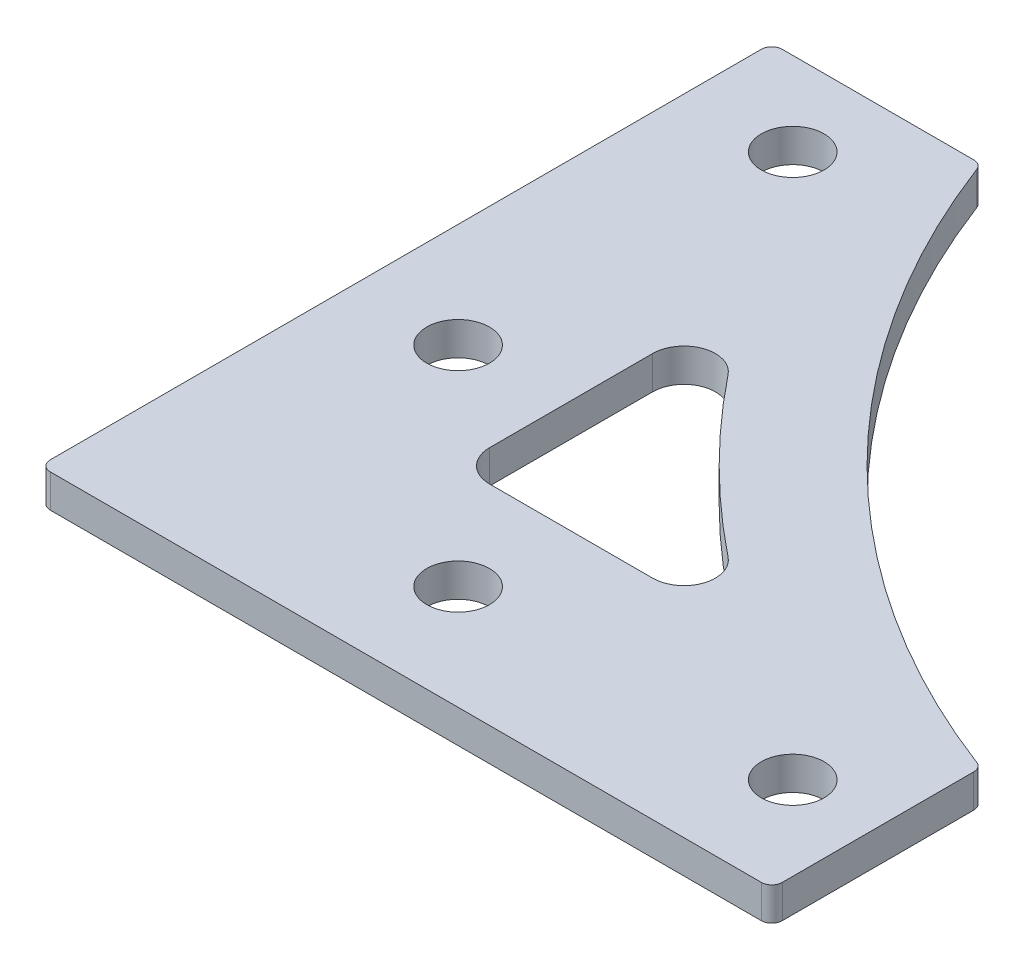
ISO-10303-21;
HEADER;
FILE_DESCRIPTION(('STEP AP214'),'2;1');
FILE_NAME('part.step','',(''),(''),'','','');
FILE_SCHEMA(('AUTOMOTIVE_DESIGN { 1 0 10303 214 1 1 1 1 }'));
ENDSEC;
DATA;
#1=APPLICATION_CONTEXT('core data for automotive mechanical design processes');
#2=APPLICATION_PROTOCOL_DEFINITION('international standard','automotive_design',2000,#1);
#3=PRODUCT_CONTEXT('',#1,'mechanical');
#4=PRODUCT('Part','Part','',(#3));
#5=PRODUCT_RELATED_PRODUCT_CATEGORY('part','',(#4));
#6=PRODUCT_DEFINITION_FORMATION('','',#4);
#7=PRODUCT_DEFINITION_CONTEXT('part definition',#1,'design');
#8=PRODUCT_DEFINITION('design','',#6,#7);
#9=PRODUCT_DEFINITION_SHAPE('','',#8);
#10=(LENGTH_UNIT() NAMED_UNIT(*) SI_UNIT(.MILLI.,.METRE.));
#11=(NAMED_UNIT(*) PLANE_ANGLE_UNIT() SI_UNIT($,.RADIAN.));
#12=(NAMED_UNIT(*) SI_UNIT($,.STERADIAN.) SOLID_ANGLE_UNIT());
#13=UNCERTAINTY_MEASURE_WITH_UNIT(LENGTH_MEASURE(1.E-05),#10,'distance_accuracy_value','');
#14=(GEOMETRIC_REPRESENTATION_CONTEXT(3) GLOBAL_UNCERTAINTY_ASSIGNED_CONTEXT((#13)) GLOBAL_UNIT_ASSIGNED_CONTEXT((#10,
#11,#12)) REPRESENTATION_CONTEXT('',''));
#15=CARTESIAN_POINT('',(0.,0.,0.));
#16=DIRECTION('',(0.,0.,1.));
#17=DIRECTION('',(1.,0.,0.));
#18=AXIS2_PLACEMENT_3D('',#15,#16,#17);
#19=CARTESIAN_POINT('',(10.,0.,40.));
#20=DIRECTION('',(0.,1.,0.));
#21=DIRECTION('',(0.,0.,1.));
#22=AXIS2_PLACEMENT_3D('',#19,#20,#21);
#23=CYLINDRICAL_SURFACE('',#22,3.);
#24=CARTESIAN_POINT('',(10.00000000001,1.00133226762955E-11,40.00000000001));
#25=DIRECTION('',(0.,-1.,3.3336664002296E-12));
#26=DIRECTION('',(0.,3.3336664002296E-12,1.));
#27=AXIS2_PLACEMENT_3D('',#24,#25,#26);
#28=CIRCLE('',#27,3.00000000001);
#29=CARTESIAN_POINT('',(10.00000000001,2.00143218770177E-11,43.00000000002));
#30=VERTEX_POINT('',#29);
#31=EDGE_CURVE('E159',#30,#30,#28,.T.);
#32=ORIENTED_EDGE('',*,*,#31,.F.);
#33=EDGE_LOOP('',(#32));
#34=FACE_BOUND('',#33,.T.);
#35=CARTESIAN_POINT('',(10.00000000001,-3.17500000000999,40.00000000001));
#36=DIRECTION('',(0.,1.,-3.33362245390155E-12));
#37=DIRECTION('',(0.,3.33362245390155E-12,1.));
#38=AXIS2_PLACEMENT_3D('',#35,#36,#37);
#39=CIRCLE('',#38,3.00000000001);
#40=CARTESIAN_POINT('',(10.00000000001,-3.17499999999999,43.00000000002));
#41=VERTEX_POINT('',#40);
#42=EDGE_CURVE('E231',#41,#41,#39,.T.);
#43=ORIENTED_EDGE('',*,*,#42,.F.);
#44=EDGE_LOOP('',(#43));
#45=FACE_BOUND('',#44,.T.);
#46=ADVANCED_FACE('F17',(#34,#45),#23,.F.);
#47=CARTESIAN_POINT('',(10.,0.,8.));
#48=DIRECTION('',(0.,1.,0.));
#49=DIRECTION('',(0.,0.,1.));
#50=AXIS2_PLACEMENT_3D('',#47,#48,#49);
#51=CYLINDRICAL_SURFACE('',#50,3.);
#52=CARTESIAN_POINT('',(10.00000000001,1.00026645352591E-11,8.00000000001));
#53=DIRECTION('',(0.,-1.,3.33366640022961E-12));
#54=DIRECTION('',(0.,3.33366640022961E-12,1.));
#55=AXIS2_PLACEMENT_3D('',#52,#53,#54);
#56=CIRCLE('',#55,3.00000000001);
#57=CARTESIAN_POINT('',(10.00000000001,2.00036637359813E-11,11.00000000002));
#58=VERTEX_POINT('',#57);
#59=EDGE_CURVE('E184',#58,#58,#56,.T.);
#60=ORIENTED_EDGE('',*,*,#59,.F.);
#61=EDGE_LOOP('',(#60));
#62=FACE_BOUND('',#61,.T.);
#63=CARTESIAN_POINT('',(10.00000000001,-3.17500000001,8.00000000001));
#64=DIRECTION('',(0.,1.,-3.33362245390155E-12));
#65=DIRECTION('',(0.,3.33362245390155E-12,1.));
#66=AXIS2_PLACEMENT_3D('',#63,#64,#65);
#67=CIRCLE('',#66,3.00000000001);
#68=CARTESIAN_POINT('',(10.00000000001,-3.175,11.00000000002));
#69=VERTEX_POINT('',#68);
#70=EDGE_CURVE('E238',#69,#69,#67,.T.);
#71=ORIENTED_EDGE('',*,*,#70,.F.);
#72=EDGE_LOOP('',(#71));
#73=FACE_BOUND('',#72,.T.);
#74=ADVANCED_FACE('F918',(#62,#73),#51,.F.);
#75=CARTESIAN_POINT('',(30.,0.,60.));
#76=DIRECTION('',(0.,1.,0.));
#77=DIRECTION('',(0.,0.,1.));
#78=AXIS2_PLACEMENT_3D('',#75,#76,#77);
#79=CYLINDRICAL_SURFACE('',#78,3.);
#80=CARTESIAN_POINT('',(30.00000000001,1.00199840144432E-11,60.00000000001));
#81=DIRECTION('',(0.,-1.,3.3336664002296E-12));
#82=DIRECTION('',(0.,3.3336664002296E-12,1.));
#83=AXIS2_PLACEMENT_3D('',#80,#81,#82);
#84=CIRCLE('',#83,3.00000000001);
#85=CARTESIAN_POINT('',(30.00000000001,2.00209832151654E-11,63.00000000002));
#86=VERTEX_POINT('',#85);
#87=EDGE_CURVE('E219',#86,#86,#84,.T.);
#88=ORIENTED_EDGE('',*,*,#87,.F.);
#89=EDGE_LOOP('',(#88));
#90=FACE_BOUND('',#89,.T.);
#91=CARTESIAN_POINT('',(30.00000000001,-3.17500000000998,60.00000000001));
#92=DIRECTION('',(0.,1.,-3.33362245390155E-12));
#93=DIRECTION('',(0.,3.33362245390155E-12,1.));
#94=AXIS2_PLACEMENT_3D('',#91,#92,#93);
#95=CIRCLE('',#94,3.00000000001);
#96=CARTESIAN_POINT('',(30.00000000001,-3.17499999999998,63.00000000002));
#97=VERTEX_POINT('',#96);
#98=EDGE_CURVE('E267',#97,#97,#95,.T.);
#99=ORIENTED_EDGE('',*,*,#98,.F.);
#100=EDGE_LOOP('',(#99));
#101=FACE_BOUND('',#100,.T.);
#102=ADVANCED_FACE('F1105',(#90,#101),#79,.F.);
#103=CARTESIAN_POINT('',(62.,0.,60.));
#104=DIRECTION('',(0.,1.,0.));
#105=DIRECTION('',(0.,0.,1.));
#106=AXIS2_PLACEMENT_3D('',#103,#104,#105);
#107=CYLINDRICAL_SURFACE('',#106,3.);
#108=CARTESIAN_POINT('',(62.00000000001,1.00199840144432E-11,60.00000000001));
#109=DIRECTION('',(0.,-1.,3.3336664002296E-12));
#110=DIRECTION('',(0.,3.3336664002296E-12,1.));
#111=AXIS2_PLACEMENT_3D('',#108,#109,#110);
#112=CIRCLE('',#111,3.00000000001);
#113=CARTESIAN_POINT('',(62.00000000001,2.00209832151654E-11,63.00000000002));
#114=VERTEX_POINT('',#113);
#115=EDGE_CURVE('E215',#114,#114,#112,.T.);
#116=ORIENTED_EDGE('',*,*,#115,.F.);
#117=EDGE_LOOP('',(#116));
#118=FACE_BOUND('',#117,.T.);
#119=CARTESIAN_POINT('',(62.00000000001,-3.17500000000998,60.00000000001));
#120=DIRECTION('',(0.,1.,-3.33362245390155E-12));
#121=DIRECTION('',(0.,3.33362245390155E-12,1.));
#122=AXIS2_PLACEMENT_3D('',#119,#120,#121);
#123=CIRCLE('',#122,3.00000000001);
#124=CARTESIAN_POINT('',(62.00000000001,-3.17499999999998,63.00000000002));
#125=VERTEX_POINT('',#124);
#126=EDGE_CURVE('E262',#125,#125,#123,.T.);
#127=ORIENTED_EDGE('',*,*,#126,.F.);
#128=EDGE_LOOP('',(#127));
#129=FACE_BOUND('',#128,.T.);
#130=ADVANCED_FACE('F1142',(#118,#129),#107,.F.);
#131=CARTESIAN_POINT('',(23.,0.,31.395610759357));
#132=DIRECTION('',(0.,-1.,0.));
#133=DIRECTION('',(0.,0.,-1.));
#134=AXIS2_PLACEMENT_3D('',#131,#132,#133);
#135=CYLINDRICAL_SURFACE('',#134,3.);
#136=CARTESIAN_POINT('',(23.00000000001,1.00104568389812E-11,31.395610759367));
#137=DIRECTION('',(0.,-1.,3.33366640022961E-12));
#138=DIRECTION('',(0.,-3.33366640022961E-12,-1.));
#139=AXIS2_PLACEMENT_3D('',#136,#137,#138);
#140=CIRCLE('',#139,3.00000000001);
#141=CARTESIAN_POINT('',(20.,0.,31.395610759357));
#142=VERTEX_POINT('',#141);
#143=CARTESIAN_POINT('',(25.3466743195682,0.,29.5266218247059));
#144=VERTEX_POINT('',#143);
#145=EDGE_CURVE('E281',#142,#144,#140,.T.);
#146=ORIENTED_EDGE('',*,*,#145,.F.);
#147=DIRECTION('',(0.,1.,0.));
#148=VECTOR('',#147,1.);
#149=CARTESIAN_POINT('',(20.00000000001,1.00104568389812E-11,31.395610759367));
#150=LINE('',#149,#148);
#151=CARTESIAN_POINT('',(20.,-3.175,31.395610759357));
#152=VERTEX_POINT('',#151);
#153=EDGE_CURVE('E246',#152,#142,#150,.T.);
#154=ORIENTED_EDGE('',*,*,#153,.F.);
#155=CARTESIAN_POINT('',(23.00000000001,-3.17500000000999,31.395610759367));
#156=DIRECTION('',(-3.33333333331111E-12,1.,-3.33362245391267E-12));
#157=DIRECTION('',(3.33564629795685E-12,-3.33362245390155E-12,-1.));
#158=AXIS2_PLACEMENT_3D('',#155,#156,#157);
#159=CIRCLE('',#158,3.00000000001);
#160=CARTESIAN_POINT('',(25.3466743195703,-3.175,29.5266218247043));
#161=VERTEX_POINT('',#160);
#162=EDGE_CURVE('E43',#161,#152,#159,.T.);
#163=ORIENTED_EDGE('',*,*,#162,.F.);
#164=DIRECTION('',(0.,-1.,0.));
#165=VECTOR('',#164,1.);
#166=CARTESIAN_POINT('',(25.3466743195782,1.00098343406167E-11,29.526621824716));
#167=LINE('',#166,#165);
#168=EDGE_CURVE('E307',#144,#161,#167,.T.);
#169=ORIENTED_EDGE('',*,*,#168,.F.);
#170=EDGE_LOOP('',(#146,#154,#163,#169));
#171=FACE_BOUND('',#170,.T.);
#172=ADVANCED_FACE('F1076',(#171),#135,.F.);
#173=CARTESIAN_POINT('',(70.,0.,50.));
#174=DIRECTION('',(0.,1.,0.));
#175=DIRECTION('',(1.,0.,0.));
#176=AXIS2_PLACEMENT_3D('',#173,#174,#175);
#177=PLANE('',#176);
#178=DIRECTION('',(1.,0.,0.));
#179=VECTOR('',#178,1.);
#180=CARTESIAN_POINT('',(70.00000000001,1.00233146835171E-11,70.00000000001));
#181=LINE('',#180,#179);
#182=CARTESIAN_POINT('',(1.,0.,70.));
#183=VERTEX_POINT('',#182);
#184=CARTESIAN_POINT('',(69.,0.,70.));
#185=VERTEX_POINT('',#184);
#186=EDGE_CURVE('E11',#183,#185,#181,.T.);
#187=ORIENTED_EDGE('',*,*,#186,.T.);
#188=CARTESIAN_POINT('',(69.00000000001,1.00229816166097E-11,69.00000000001));
#189=DIRECTION('',(0.,-1.,1.00003330668074E-11));
#190=DIRECTION('',(0.,-1.00003330668074E-11,-1.));
#191=AXIS2_PLACEMENT_3D('',#188,#189,#190);
#192=CIRCLE('',#191,1.00000000001);
#193=CARTESIAN_POINT('',(70.,0.,69.));
#194=VERTEX_POINT('',#193);
#195=EDGE_CURVE('E205',#194,#185,#192,.T.);
#196=ORIENTED_EDGE('',*,*,#195,.F.);
#197=DIRECTION('',(0.,0.,-1.));
#198=VECTOR('',#197,1.);
#199=CARTESIAN_POINT('',(70.00000000001,1.00166533453694E-11,50.00000000001));
#200=LINE('',#199,#198);
#201=CARTESIAN_POINT('',(70.,0.,50.691740945641));
#202=VERTEX_POINT('',#201);
#203=EDGE_CURVE('E28',#194,#202,#200,.T.);
#204=ORIENTED_EDGE('',*,*,#203,.T.);
#205=CARTESIAN_POINT('',(69.00000000001,1.00168837413868E-11,50.691740945651));
#206=DIRECTION('',(0.,-1.,1.00003330668074E-11));
#207=DIRECTION('',(0.,-1.00003330668074E-11,-1.));
#208=AXIS2_PLACEMENT_3D('',#205,#206,#207);
#209=CIRCLE('',#208,1.00000000001);
#210=CARTESIAN_POINT('',(69.3564886950297,0.,49.757441309385));
#211=VERTEX_POINT('',#210);
#212=EDGE_CURVE('E81',#211,#202,#209,.T.);
#213=ORIENTED_EDGE('',*,*,#212,.F.);
#214=CARTESIAN_POINT('',(99.658027772699,-1.00098781075895E-11,-29.65802777269));
#215=DIRECTION('',(0.,-1.,1.17980125730903E-13));
#216=DIRECTION('',(0.,1.17980125730903E-13,1.));
#217=AXIS2_PLACEMENT_3D('',#214,#215,#216);
#218=CIRCLE('',#217,85.00000000001);
#219=CARTESIAN_POINT('',(20.2425586906175,0.,0.643511304969427));
#220=VERTEX_POINT('',#219);
#221=EDGE_CURVE('E187',#211,#220,#218,.T.);
#222=ORIENTED_EDGE('',*,*,#221,.T.);
#223=CARTESIAN_POINT('',(19.308259054369,1.00003330669074E-11,1.00000000001));
#224=DIRECTION('',(0.,-1.,1.00003330668074E-11));
#225=DIRECTION('',(0.,-1.00003330668074E-11,-1.));
#226=AXIS2_PLACEMENT_3D('',#223,#224,#225);
#227=CIRCLE('',#226,1.00000000001);
#228=CARTESIAN_POINT('',(19.308259054359,0.,0.));
#229=VERTEX_POINT('',#228);
#230=EDGE_CURVE('E96',#229,#220,#227,.T.);
#231=ORIENTED_EDGE('',*,*,#230,.F.);
#232=DIRECTION('',(-1.,0.,0.));
#233=VECTOR('',#232,1.);
#234=CARTESIAN_POINT('',(70.00000000001,1.E-11,-1.E-11));
#235=LINE('',#234,#233);
#236=CARTESIAN_POINT('',(1.,0.,0.));
#237=VERTEX_POINT('',#236);
#238=EDGE_CURVE('E145',#229,#237,#235,.T.);
#239=ORIENTED_EDGE('',*,*,#238,.T.);
#240=CARTESIAN_POINT('',(1.00000000001,1.00003330669074E-11,1.00000000001));
#241=DIRECTION('',(0.,-1.,1.00003330668074E-11));
#242=DIRECTION('',(0.,-1.00003330668074E-11,-1.));
#243=AXIS2_PLACEMENT_3D('',#240,#241,#242);
#244=CIRCLE('',#243,1.00000000001);
#245=CARTESIAN_POINT('',(0.,0.,1.));
#246=VERTEX_POINT('',#245);
#247=EDGE_CURVE('E137',#246,#237,#244,.T.);
#248=ORIENTED_EDGE('',*,*,#247,.F.);
#249=DIRECTION('',(0.,0.,1.));
#250=VECTOR('',#249,1.);
#251=CARTESIAN_POINT('',(0.,1.00166533453694E-11,50.00000000001));
#252=LINE('',#251,#250);
#253=CARTESIAN_POINT('',(0.,0.,69.));
#254=VERTEX_POINT('',#253);
#255=EDGE_CURVE('E142',#246,#254,#252,.T.);
#256=ORIENTED_EDGE('',*,*,#255,.T.);
#257=CARTESIAN_POINT('',(1.00000000001,1.00229816166097E-11,69.00000000001));
#258=DIRECTION('',(0.,-1.,1.00003330668074E-11));
#259=DIRECTION('',(0.,-1.00003330668074E-11,-1.));
#260=AXIS2_PLACEMENT_3D('',#257,#258,#259);
#261=CIRCLE('',#260,1.00000000001);
#262=EDGE_CURVE('E193',#183,#254,#261,.T.);
#263=ORIENTED_EDGE('',*,*,#262,.F.);
#264=EDGE_LOOP('',(#187,#196,#204,#213,#222,#231,#239,#248,#256,#263));
#265=FACE_BOUND('',#264,.T.);
#266=ORIENTED_EDGE('',*,*,#31,.T.);
#267=EDGE_LOOP('',(#266));
#268=FACE_BOUND('',#267,.T.);
#269=ORIENTED_EDGE('',*,*,#59,.T.);
#270=EDGE_LOOP('',(#269));
#271=FACE_BOUND('',#270,.T.);
#272=ORIENTED_EDGE('',*,*,#87,.T.);
#273=EDGE_LOOP('',(#272));
#274=FACE_BOUND('',#273,.T.);
#275=ORIENTED_EDGE('',*,*,#115,.T.);
#276=EDGE_LOOP('',(#275));
#277=FACE_BOUND('',#276,.T.);
#278=CARTESIAN_POINT('',(99.658027772699,-1.00098781075895E-11,-29.65802777269));
#279=DIRECTION('',(0.,1.,-1.05596224802113E-13));
#280=DIRECTION('',(0.,1.05596224802113E-13,1.));
#281=AXIS2_PLACEMENT_3D('',#278,#279,#280);
#282=CIRCLE('',#281,95.00000000001);
#283=CARTESIAN_POINT('',(40.4733781752974,0.,44.6533256804279));
#284=VERTEX_POINT('',#283);
#285=EDGE_CURVE('E220',#144,#284,#282,.T.);
#286=ORIENTED_EDGE('',*,*,#285,.T.);
#287=CARTESIAN_POINT('',(38.604389240653,1.00156541446472E-11,47.00000000001));
#288=DIRECTION('',(0.,-1.,3.3336664002296E-12));
#289=DIRECTION('',(0.,-3.3336664002296E-12,-1.));
#290=AXIS2_PLACEMENT_3D('',#287,#288,#289);
#291=CIRCLE('',#290,3.00000000001);
#292=CARTESIAN_POINT('',(38.604389240643,0.,50.));
#293=VERTEX_POINT('',#292);
#294=EDGE_CURVE('E198',#284,#293,#291,.T.);
#295=ORIENTED_EDGE('',*,*,#294,.T.);
#296=DIRECTION('',(-1.,0.,0.));
#297=VECTOR('',#296,1.);
#298=CARTESIAN_POINT('',(70.00000000001,1.00166533453694E-11,50.00000000001));
#299=LINE('',#298,#297);
#300=CARTESIAN_POINT('',(23.,0.,50.));
#301=VERTEX_POINT('',#300);
#302=EDGE_CURVE('E194',#293,#301,#299,.T.);
#303=ORIENTED_EDGE('',*,*,#302,.T.);
#304=CARTESIAN_POINT('',(23.00000000001,1.00156541446472E-11,47.00000000001));
#305=DIRECTION('',(0.,-1.,3.3336664002296E-12));
#306=DIRECTION('',(0.,-3.3336664002296E-12,-1.));
#307=AXIS2_PLACEMENT_3D('',#304,#305,#306);
#308=CIRCLE('',#307,3.00000000001);
#309=CARTESIAN_POINT('',(20.,0.,47.));
#310=VERTEX_POINT('',#309);
#311=EDGE_CURVE('E199',#301,#310,#308,.T.);
#312=ORIENTED_EDGE('',*,*,#311,.T.);
#313=DIRECTION('',(0.,0.,-1.));
#314=VECTOR('',#313,1.);
#315=CARTESIAN_POINT('',(20.00000000001,1.00166533453694E-11,50.00000000001));
#316=LINE('',#315,#314);
#317=EDGE_CURVE('E280',#310,#142,#316,.T.);
#318=ORIENTED_EDGE('',*,*,#317,.T.);
#319=ORIENTED_EDGE('',*,*,#145,.T.);
#320=EDGE_LOOP('',(#286,#295,#303,#312,#318,#319));
#321=FACE_BOUND('',#320,.T.);
#322=ADVANCED_FACE('F139',(#265,#268,#271,#274,#277,#321),#177,.T.);
#323=CARTESIAN_POINT('',(38.604389240643,0.,47.));
#324=DIRECTION('',(0.,-1.,0.));
#325=DIRECTION('',(0.,0.,-1.));
#326=AXIS2_PLACEMENT_3D('',#323,#324,#325);
#327=CYLINDRICAL_SURFACE('',#326,3.);
#328=DIRECTION('',(0.,1.,0.));
#329=VECTOR('',#328,1.);
#330=CARTESIAN_POINT('',(40.4733781753072,1.00148725450889E-11,44.6533256804377));
#331=LINE('',#330,#329);
#332=CARTESIAN_POINT('',(40.4733781752974,-3.175,44.6533256804279));
#333=VERTEX_POINT('',#332);
#334=EDGE_CURVE('E285',#333,#284,#331,.T.);
#335=ORIENTED_EDGE('',*,*,#334,.F.);
#336=CARTESIAN_POINT('',(38.604389240653,-3.17500000000999,47.00000000001));
#337=DIRECTION('',(0.,1.,-3.33362245390155E-12));
#338=DIRECTION('',(0.,-3.33362245390155E-12,-1.));
#339=AXIS2_PLACEMENT_3D('',#336,#337,#338);
#340=CIRCLE('',#339,3.00000000001);
#341=CARTESIAN_POINT('',(38.604389240643,-3.175,50.));
#342=VERTEX_POINT('',#341);
#343=EDGE_CURVE('E176',#342,#333,#340,.T.);
#344=ORIENTED_EDGE('',*,*,#343,.F.);
#345=DIRECTION('',(0.,-1.,0.));
#346=VECTOR('',#345,1.);
#347=CARTESIAN_POINT('',(38.604389240653,1.00166533453694E-11,50.00000000001));
#348=LINE('',#347,#346);
#349=EDGE_CURVE('E275',#293,#342,#348,.T.);
#350=ORIENTED_EDGE('',*,*,#349,.F.);
#351=ORIENTED_EDGE('',*,*,#294,.F.);
#352=EDGE_LOOP('',(#335,#344,#350,#351));
#353=FACE_BOUND('',#352,.T.);
#354=ADVANCED_FACE('F344',(#353),#327,.F.);
#355=CARTESIAN_POINT('',(99.658027772689,0.,-29.65802777268));
#356=DIRECTION('',(0.,1.,0.));
#357=DIRECTION('',(0.,0.,1.));
#358=AXIS2_PLACEMENT_3D('',#355,#356,#357);
#359=CYLINDRICAL_SURFACE('',#358,95.);
#360=ORIENTED_EDGE('',*,*,#334,.T.);
#361=ORIENTED_EDGE('',*,*,#285,.F.);
#362=ORIENTED_EDGE('',*,*,#168,.T.);
#363=CARTESIAN_POINT('',(99.658027772699,-3.17500000001001,-29.65802777269));
#364=DIRECTION('',(0.,1.,-1.05596407404584E-13));
#365=DIRECTION('',(0.,1.05596407404584E-13,1.));
#366=AXIS2_PLACEMENT_3D('',#363,#364,#365);
#367=CIRCLE('',#366,95.00000000001);
#368=EDGE_CURVE('E313',#161,#333,#367,.T.);
#369=ORIENTED_EDGE('',*,*,#368,.T.);
#370=EDGE_LOOP('',(#360,#361,#362,#369));
#371=FACE_BOUND('',#370,.T.);
#372=ADVANCED_FACE('F1065',(#371),#359,.T.);
#373=CARTESIAN_POINT('',(20.,0.,50.));
#374=DIRECTION('',(1.,0.,0.));
#375=DIRECTION('',(0.,1.,0.));
#376=AXIS2_PLACEMENT_3D('',#373,#374,#375);
#377=PLANE('',#376);
#378=DIRECTION('',(0.,0.,-1.));
#379=VECTOR('',#378,1.);
#380=CARTESIAN_POINT('',(20.00000000001,-3.17500000000999,50.00000000001));
#381=LINE('',#380,#379);
#382=CARTESIAN_POINT('',(20.,-3.175,47.));
#383=VERTEX_POINT('',#382);
#384=EDGE_CURVE('E309',#383,#152,#381,.T.);
#385=ORIENTED_EDGE('',*,*,#384,.T.);
#386=ORIENTED_EDGE('',*,*,#153,.T.);
#387=ORIENTED_EDGE('',*,*,#317,.F.);
#388=DIRECTION('',(0.,-1.,0.));
#389=VECTOR('',#388,1.);
#390=CARTESIAN_POINT('',(20.00000000001,1.00159872115546E-11,47.00000000001));
#391=LINE('',#390,#389);
#392=EDGE_CURVE('E242',#310,#383,#391,.T.);
#393=ORIENTED_EDGE('',*,*,#392,.T.);
#394=EDGE_LOOP('',(#385,#386,#387,#393));
#395=FACE_BOUND('',#394,.T.);
#396=ADVANCED_FACE('F1048',(#395),#377,.T.);
#397=CARTESIAN_POINT('',(23.,0.,47.));
#398=DIRECTION('',(0.,-1.,0.));
#399=DIRECTION('',(0.,0.,-1.));
#400=AXIS2_PLACEMENT_3D('',#397,#398,#399);
#401=CYLINDRICAL_SURFACE('',#400,3.);
#402=CARTESIAN_POINT('',(23.00000000001,-3.17500000000999,47.00000000001));
#403=DIRECTION('',(0.,1.,-3.33362245390155E-12));
#404=DIRECTION('',(0.,-3.33362245390155E-12,-1.));
#405=AXIS2_PLACEMENT_3D('',#402,#403,#404);
#406=CIRCLE('',#405,3.00000000001);
#407=CARTESIAN_POINT('',(23.,-3.175,50.));
#408=VERTEX_POINT('',#407);
#409=EDGE_CURVE('E263',#383,#408,#406,.T.);
#410=ORIENTED_EDGE('',*,*,#409,.F.);
#411=ORIENTED_EDGE('',*,*,#392,.F.);
#412=ORIENTED_EDGE('',*,*,#311,.F.);
#413=DIRECTION('',(0.,1.,0.));
#414=VECTOR('',#413,1.);
#415=CARTESIAN_POINT('',(23.00000000001,1.00166533453694E-11,50.00000000001));
#416=LINE('',#415,#414);
#417=EDGE_CURVE('E272',#408,#301,#416,.T.);
#418=ORIENTED_EDGE('',*,*,#417,.F.);
#419=EDGE_LOOP('',(#410,#411,#412,#418));
#420=FACE_BOUND('',#419,.T.);
#421=ADVANCED_FACE('F1043',(#420),#401,.F.);
#422=CARTESIAN_POINT('',(47.893188244631,0.,50.));
#423=DIRECTION('',(0.,0.,-1.));
#424=DIRECTION('',(0.,-1.,0.));
#425=AXIS2_PLACEMENT_3D('',#422,#423,#424);
#426=PLANE('',#425);
#427=DIRECTION('',(-1.,0.,0.));
#428=VECTOR('',#427,1.);
#429=CARTESIAN_POINT('',(47.893188244641,-3.17500000000999,50.00000000001));
#430=LINE('',#429,#428);
#431=EDGE_CURVE('E247',#342,#408,#430,.T.);
#432=ORIENTED_EDGE('',*,*,#431,.T.);
#433=ORIENTED_EDGE('',*,*,#417,.T.);
#434=ORIENTED_EDGE('',*,*,#302,.F.);
#435=ORIENTED_EDGE('',*,*,#349,.T.);
#436=EDGE_LOOP('',(#432,#433,#434,#435));
#437=FACE_BOUND('',#436,.T.);
#438=ADVANCED_FACE('F1047',(#437),#426,.T.);
#439=CARTESIAN_POINT('',(70.,0.,70.));
#440=DIRECTION('',(0.,0.,-1.));
#441=DIRECTION('',(0.,-1.,0.));
#442=AXIS2_PLACEMENT_3D('',#439,#440,#441);
#443=PLANE('',#442);
#444=DIRECTION('',(-1.,0.,0.));
#445=VECTOR('',#444,1.);
#446=CARTESIAN_POINT('',(70.00000000001,-3.17500000000998,70.00000000001));
#447=LINE('',#446,#445);
#448=CARTESIAN_POINT('',(69.,-3.175,70.));
#449=VERTEX_POINT('',#448);
#450=CARTESIAN_POINT('',(1.,-3.175,70.));
#451=VERTEX_POINT('',#450);
#452=EDGE_CURVE('E254',#449,#451,#447,.T.);
#453=ORIENTED_EDGE('',*,*,#452,.F.);
#454=DIRECTION('',(0.,-1.,0.));
#455=VECTOR('',#454,1.);
#456=CARTESIAN_POINT('',(69.00000000001,1.00233146835171E-11,70.00000000001));
#457=LINE('',#456,#455);
#458=EDGE_CURVE('E172',#185,#449,#457,.T.);
#459=ORIENTED_EDGE('',*,*,#458,.F.);
#460=ORIENTED_EDGE('',*,*,#186,.F.);
#461=DIRECTION('',(0.,1.,0.));
#462=VECTOR('',#461,1.);
#463=CARTESIAN_POINT('',(1.00000000001,1.00233146835171E-11,70.00000000001));
#464=LINE('',#463,#462);
#465=EDGE_CURVE('E188',#451,#183,#464,.T.);
#466=ORIENTED_EDGE('',*,*,#465,.F.);
#467=EDGE_LOOP('',(#453,#459,#460,#466));
#468=FACE_BOUND('',#467,.T.);
#469=ADVANCED_FACE('F1057',(#468),#443,.F.);
#470=CARTESIAN_POINT('',(0.,0.,70.));
#471=DIRECTION('',(1.,0.,0.));
#472=DIRECTION('',(0.,1.,0.));
#473=AXIS2_PLACEMENT_3D('',#470,#471,#472);
#474=PLANE('',#473);
#475=DIRECTION('',(0.,0.,-1.));
#476=VECTOR('',#475,1.);
#477=CARTESIAN_POINT('',(0.,-3.17500000000998,70.00000000001));
#478=LINE('',#477,#476);
#479=CARTESIAN_POINT('',(0.,-3.175,69.));
#480=VERTEX_POINT('',#479);
#481=CARTESIAN_POINT('',(0.,-3.175,1.));
#482=VERTEX_POINT('',#481);
#483=EDGE_CURVE('E251',#480,#482,#478,.T.);
#484=ORIENTED_EDGE('',*,*,#483,.F.);
#485=DIRECTION('',(0.,-1.,0.));
#486=VECTOR('',#485,1.);
#487=CARTESIAN_POINT('',(0.,1.00230926389122E-11,69.00000000001));
#488=LINE('',#487,#486);
#489=EDGE_CURVE('E158',#254,#480,#488,.T.);
#490=ORIENTED_EDGE('',*,*,#489,.F.);
#491=ORIENTED_EDGE('',*,*,#255,.F.);
#492=DIRECTION('',(0.,1.,0.));
#493=VECTOR('',#492,1.);
#494=CARTESIAN_POINT('',(0.,1.00079936057773E-11,1.00000000001));
#495=LINE('',#494,#493);
#496=EDGE_CURVE('E149',#482,#246,#495,.T.);
#497=ORIENTED_EDGE('',*,*,#496,.F.);
#498=EDGE_LOOP('',(#484,#490,#491,#497));
#499=FACE_BOUND('',#498,.T.);
#500=ADVANCED_FACE('F155',(#499),#474,.F.);
#501=CARTESIAN_POINT('',(0.,0.,0.));
#502=DIRECTION('',(0.,0.,1.));
#503=DIRECTION('',(1.,0.,0.));
#504=AXIS2_PLACEMENT_3D('',#501,#502,#503);
#505=PLANE('',#504);
#506=DIRECTION('',(1.,0.,0.));
#507=VECTOR('',#506,1.);
#508=CARTESIAN_POINT('',(0.,-3.17500000001,1.00010574874309E-11));
#509=LINE('',#508,#507);
#510=CARTESIAN_POINT('',(1.,-3.175,0.));
#511=VERTEX_POINT('',#510);
#512=CARTESIAN_POINT('',(19.308259054359,-3.175,0.));
#513=VERTEX_POINT('',#512);
#514=EDGE_CURVE('E21',#511,#513,#509,.T.);
#515=ORIENTED_EDGE('',*,*,#514,.F.);
#516=DIRECTION('',(0.,-1.,0.));
#517=VECTOR('',#516,1.);
#518=CARTESIAN_POINT('',(1.00000000001,0.,0.));
#519=LINE('',#518,#517);
#520=EDGE_CURVE('E150',#237,#511,#519,.T.);
#521=ORIENTED_EDGE('',*,*,#520,.F.);
#522=ORIENTED_EDGE('',*,*,#238,.F.);
#523=DIRECTION('',(0.,1.,0.));
#524=VECTOR('',#523,1.);
#525=CARTESIAN_POINT('',(19.308259054369,0.,0.));
#526=LINE('',#525,#524);
#527=EDGE_CURVE('E214',#513,#229,#526,.T.);
#528=ORIENTED_EDGE('',*,*,#527,.F.);
#529=EDGE_LOOP('',(#515,#521,#522,#528));
#530=FACE_BOUND('',#529,.T.);
#531=ADVANCED_FACE('F393',(#530),#505,.F.);
#532=CARTESIAN_POINT('',(99.658027772689,0.,-29.65802777268));
#533=DIRECTION('',(0.,1.,0.));
#534=DIRECTION('',(0.,0.,1.));
#535=AXIS2_PLACEMENT_3D('',#532,#533,#534);
#536=CYLINDRICAL_SURFACE('',#535,85.);
#537=DIRECTION('',(0.,1.,0.));
#538=VECTOR('',#537,1.);
#539=CARTESIAN_POINT('',(69.3564886950381,1.00165725570964E-11,49.7574413093986));
#540=LINE('',#539,#538);
#541=CARTESIAN_POINT('',(69.3564886950297,-3.175,49.757441309385));
#542=VERTEX_POINT('',#541);
#543=EDGE_CURVE('E256',#542,#211,#540,.T.);
#544=ORIENTED_EDGE('',*,*,#543,.F.);
#545=CARTESIAN_POINT('',(99.658027772699,-3.17500000001001,-29.65802777269));
#546=DIRECTION('',(0.,1.,-1.17978697135099E-13));
#547=DIRECTION('',(0.,1.17978697135099E-13,1.));
#548=AXIS2_PLACEMENT_3D('',#545,#546,#547);
#549=CIRCLE('',#548,85.00000000001);
#550=CARTESIAN_POINT('',(20.2425586906175,-3.175,0.643511304969428));
#551=VERTEX_POINT('',#550);
#552=EDGE_CURVE('E230',#551,#542,#549,.T.);
#553=ORIENTED_EDGE('',*,*,#552,.F.);
#554=DIRECTION('',(0.,-1.,0.));
#555=VECTOR('',#554,1.);
#556=CARTESIAN_POINT('',(20.2425586906262,1.00002143323202E-11,0.643511304980028));
#557=LINE('',#556,#555);
#558=EDGE_CURVE('E258',#220,#551,#557,.T.);
#559=ORIENTED_EDGE('',*,*,#558,.F.);
#560=ORIENTED_EDGE('',*,*,#221,.F.);
#561=EDGE_LOOP('',(#544,#553,#559,#560));
#562=FACE_BOUND('',#561,.T.);
#563=ADVANCED_FACE('F372',(#562),#536,.F.);
#564=CARTESIAN_POINT('',(70.,0.,50.));
#565=DIRECTION('',(-1.,0.,0.));
#566=DIRECTION('',(0.,0.,1.));
#567=AXIS2_PLACEMENT_3D('',#564,#565,#566);
#568=PLANE('',#567);
#569=DIRECTION('',(0.,0.,1.));
#570=VECTOR('',#569,1.);
#571=CARTESIAN_POINT('',(70.00000000001,-3.17500000000999,50.00000000001));
#572=LINE('',#571,#570);
#573=CARTESIAN_POINT('',(70.,-3.175,50.691740945641));
#574=VERTEX_POINT('',#573);
#575=CARTESIAN_POINT('',(70.,-3.175,69.));
#576=VERTEX_POINT('',#575);
#577=EDGE_CURVE('E226',#574,#576,#572,.T.);
#578=ORIENTED_EDGE('',*,*,#577,.F.);
#579=DIRECTION('',(0.,-1.,0.));
#580=VECTOR('',#579,1.);
#581=CARTESIAN_POINT('',(70.00000000001,1.00168069427144E-11,50.691740945651));
#582=LINE('',#581,#580);
#583=EDGE_CURVE('E210',#202,#574,#582,.T.);
#584=ORIENTED_EDGE('',*,*,#583,.F.);
#585=ORIENTED_EDGE('',*,*,#203,.F.);
#586=DIRECTION('',(0.,1.,0.));
#587=VECTOR('',#586,1.);
#588=CARTESIAN_POINT('',(70.00000000001,1.00208721928629E-11,69.00000000001));
#589=LINE('',#588,#587);
#590=EDGE_CURVE('E200',#576,#194,#589,.T.);
#591=ORIENTED_EDGE('',*,*,#590,.F.);
#592=EDGE_LOOP('',(#578,#584,#585,#591));
#593=FACE_BOUND('',#592,.T.);
#594=ADVANCED_FACE('F423',(#593),#568,.F.);
#595=CARTESIAN_POINT('',(70.,-3.175,50.));
#596=DIRECTION('',(0.,1.,0.));
#597=DIRECTION('',(1.,0.,0.));
#598=AXIS2_PLACEMENT_3D('',#595,#596,#597);
#599=PLANE('',#598);
#600=ORIENTED_EDGE('',*,*,#452,.T.);
#601=CARTESIAN_POINT('',(1.00000000001,-3.17500000000998,69.00000000001));
#602=DIRECTION('',(0.,1.,-1.0000433680769E-11));
#603=DIRECTION('',(0.,-1.0000433680769E-11,-1.));
#604=AXIS2_PLACEMENT_3D('',#601,#602,#603);
#605=CIRCLE('',#604,1.00000000001);
#606=EDGE_CURVE('E192',#480,#451,#605,.T.);
#607=ORIENTED_EDGE('',*,*,#606,.F.);
#608=ORIENTED_EDGE('',*,*,#483,.T.);
#609=CARTESIAN_POINT('',(1.00000000001,-3.17500000001,1.00000000001));
#610=DIRECTION('',(0.,1.,-1.0000433680769E-11));
#611=DIRECTION('',(0.,-1.0000433680769E-11,-1.));
#612=AXIS2_PLACEMENT_3D('',#609,#610,#611);
#613=CIRCLE('',#612,1.00000000001);
#614=EDGE_CURVE('E164',#511,#482,#613,.T.);
#615=ORIENTED_EDGE('',*,*,#614,.F.);
#616=ORIENTED_EDGE('',*,*,#514,.T.);
#617=CARTESIAN_POINT('',(19.308259054369,-3.17500000001,1.00000000001));
#618=DIRECTION('',(9.99999999979993E-12,1.,-1.00004336808691E-11));
#619=DIRECTION('',(-1.00069388938038E-11,-1.0000433680769E-11,-1.));
#620=AXIS2_PLACEMENT_3D('',#617,#618,#619);
#621=CIRCLE('',#620,1.00000000001);
#622=EDGE_CURVE('E180',#551,#513,#621,.T.);
#623=ORIENTED_EDGE('',*,*,#622,.F.);
#624=ORIENTED_EDGE('',*,*,#552,.T.);
#625=CARTESIAN_POINT('',(69.00000000001,-3.17500000000999,50.691740945651));
#626=DIRECTION('',(9.99999999979985E-12,1.,-1.00004336808691E-11));
#627=DIRECTION('',(-1.00138777877077E-11,-1.0000433680769E-11,-1.));
#628=AXIS2_PLACEMENT_3D('',#625,#626,#627);
#629=CIRCLE('',#628,1.00000000001);
#630=EDGE_CURVE('E206',#574,#542,#629,.T.);
#631=ORIENTED_EDGE('',*,*,#630,.F.);
#632=ORIENTED_EDGE('',*,*,#577,.T.);
#633=CARTESIAN_POINT('',(69.00000000001,-3.17500000000998,69.00000000001));
#634=DIRECTION('',(0.,1.,-1.0000433680769E-11));
#635=DIRECTION('',(0.,-1.0000433680769E-11,-1.));
#636=AXIS2_PLACEMENT_3D('',#633,#634,#635);
#637=CIRCLE('',#636,1.00000000001);
#638=EDGE_CURVE('E204',#449,#576,#637,.T.);
#639=ORIENTED_EDGE('',*,*,#638,.F.);
#640=EDGE_LOOP('',(#600,#607,#608,#615,#616,#623,#624,#631,#632,#639));
#641=FACE_BOUND('',#640,.T.);
#642=ORIENTED_EDGE('',*,*,#42,.T.);
#643=EDGE_LOOP('',(#642));
#644=FACE_BOUND('',#643,.T.);
#645=ORIENTED_EDGE('',*,*,#70,.T.);
#646=EDGE_LOOP('',(#645));
#647=FACE_BOUND('',#646,.T.);
#648=ORIENTED_EDGE('',*,*,#98,.T.);
#649=EDGE_LOOP('',(#648));
#650=FACE_BOUND('',#649,.T.);
#651=ORIENTED_EDGE('',*,*,#126,.T.);
#652=EDGE_LOOP('',(#651));
#653=FACE_BOUND('',#652,.T.);
#654=ORIENTED_EDGE('',*,*,#368,.F.);
#655=ORIENTED_EDGE('',*,*,#162,.T.);
#656=ORIENTED_EDGE('',*,*,#384,.F.);
#657=ORIENTED_EDGE('',*,*,#409,.T.);
#658=ORIENTED_EDGE('',*,*,#431,.F.);
#659=ORIENTED_EDGE('',*,*,#343,.T.);
#660=EDGE_LOOP('',(#654,#655,#656,#657,#658,#659));
#661=FACE_BOUND('',#660,.T.);
#662=ADVANCED_FACE('F376',(#641,#644,#647,#650,#653,#661),#599,.F.);
#663=CARTESIAN_POINT('',(1.,0.,69.));
#664=DIRECTION('',(0.,-1.,0.));
#665=DIRECTION('',(0.,0.,-1.));
#666=AXIS2_PLACEMENT_3D('',#663,#664,#665);
#667=CYLINDRICAL_SURFACE('',#666,1.);
#668=ORIENTED_EDGE('',*,*,#606,.T.);
#669=ORIENTED_EDGE('',*,*,#465,.T.);
#670=ORIENTED_EDGE('',*,*,#262,.T.);
#671=ORIENTED_EDGE('',*,*,#489,.T.);
#672=EDGE_LOOP('',(#668,#669,#670,#671));
#673=FACE_BOUND('',#672,.T.);
#674=ADVANCED_FACE('F1037',(#673),#667,.T.);
#675=CARTESIAN_POINT('',(69.,0.,69.));
#676=DIRECTION('',(0.,-1.,0.));
#677=DIRECTION('',(0.,0.,-1.));
#678=AXIS2_PLACEMENT_3D('',#675,#676,#677);
#679=CYLINDRICAL_SURFACE('',#678,1.);
#680=ORIENTED_EDGE('',*,*,#638,.T.);
#681=ORIENTED_EDGE('',*,*,#590,.T.);
#682=ORIENTED_EDGE('',*,*,#195,.T.);
#683=ORIENTED_EDGE('',*,*,#458,.T.);
#684=EDGE_LOOP('',(#680,#681,#682,#683));
#685=FACE_BOUND('',#684,.T.);
#686=ADVANCED_FACE('F1033',(#685),#679,.T.);
#687=CARTESIAN_POINT('',(1.,0.,1.));
#688=DIRECTION('',(0.,-1.,0.));
#689=DIRECTION('',(0.,0.,-1.));
#690=AXIS2_PLACEMENT_3D('',#687,#688,#689);
#691=CYLINDRICAL_SURFACE('',#690,1.);
#692=ORIENTED_EDGE('',*,*,#614,.T.);
#693=ORIENTED_EDGE('',*,*,#496,.T.);
#694=ORIENTED_EDGE('',*,*,#247,.T.);
#695=ORIENTED_EDGE('',*,*,#520,.T.);
#696=EDGE_LOOP('',(#692,#693,#694,#695));
#697=FACE_BOUND('',#696,.T.);
#698=ADVANCED_FACE('F162',(#697),#691,.T.);
#699=CARTESIAN_POINT('',(19.308259054359,0.,1.));
#700=DIRECTION('',(0.,-1.,0.));
#701=DIRECTION('',(0.,0.,-1.));
#702=AXIS2_PLACEMENT_3D('',#699,#700,#701);
#703=CYLINDRICAL_SURFACE('',#702,1.);
#704=ORIENTED_EDGE('',*,*,#622,.T.);
#705=ORIENTED_EDGE('',*,*,#527,.T.);
#706=ORIENTED_EDGE('',*,*,#230,.T.);
#707=ORIENTED_EDGE('',*,*,#558,.T.);
#708=EDGE_LOOP('',(#704,#705,#706,#707));
#709=FACE_BOUND('',#708,.T.);
#710=ADVANCED_FACE('F367',(#709),#703,.T.);
#711=CARTESIAN_POINT('',(69.,0.,50.691740945641));
#712=DIRECTION('',(0.,-1.,0.));
#713=DIRECTION('',(0.,0.,-1.));
#714=AXIS2_PLACEMENT_3D('',#711,#712,#713);
#715=CYLINDRICAL_SURFACE('',#714,1.);
#716=ORIENTED_EDGE('',*,*,#543,.T.);
#717=ORIENTED_EDGE('',*,*,#212,.T.);
#718=ORIENTED_EDGE('',*,*,#583,.T.);
#719=ORIENTED_EDGE('',*,*,#630,.T.);
#720=EDGE_LOOP('',(#716,#717,#718,#719));
#721=FACE_BOUND('',#720,.T.);
#722=ADVANCED_FACE('F19',(#721),#715,.T.);
#723=CLOSED_SHELL('',(#46,#74,#102,#130,#172,#322,#354,#372,#396,#421,#438,#469,#500,#531,#563,
#594,#662,#674,#686,#698,#710,#722));
#724=MANIFOLD_SOLID_BREP('B1',#723);
#725=ADVANCED_BREP_SHAPE_REPRESENTATION('',(#18,#724),#14);
#726=SHAPE_DEFINITION_REPRESENTATION(#9,#725);
ENDSEC;
END-ISO-10303-21;
